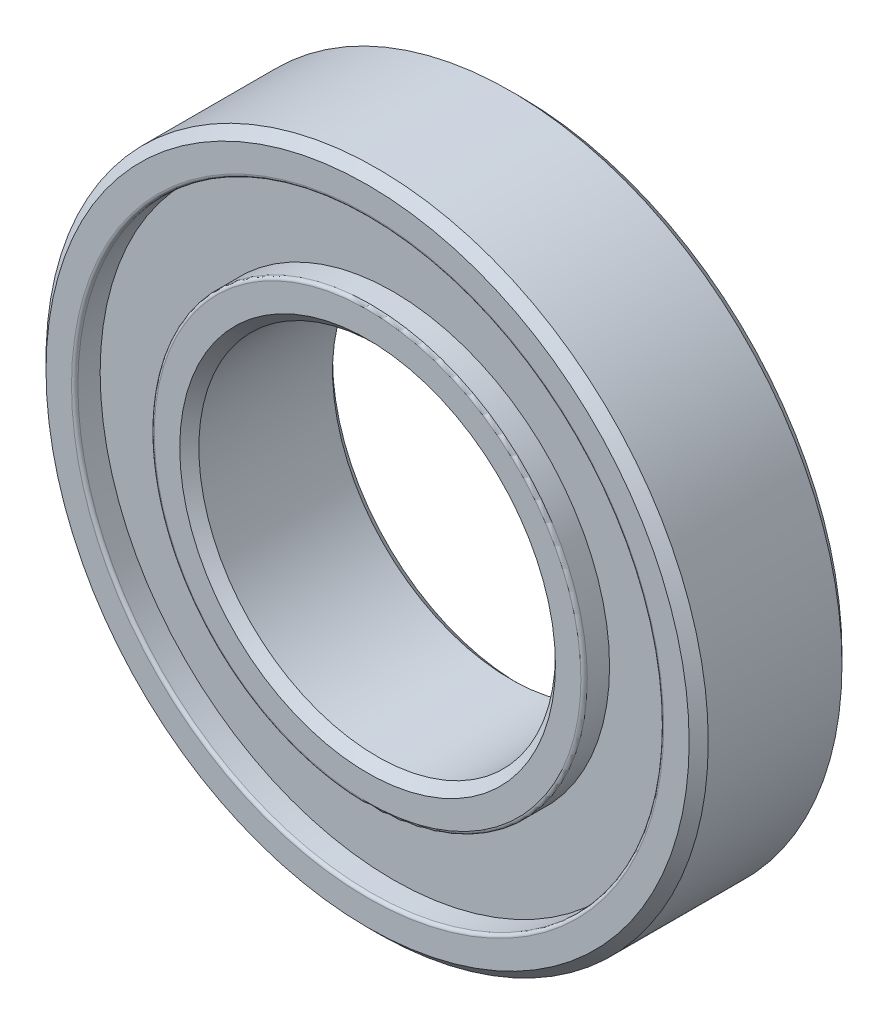
ISO-10303-21;
HEADER;
FILE_DESCRIPTION(('STEP AP214'),'2;1');
FILE_NAME('part.step','',(''),(''),'','','');
FILE_SCHEMA(('AUTOMOTIVE_DESIGN { 1 0 10303 214 1 1 1 1 }'));
ENDSEC;
DATA;
#1=APPLICATION_CONTEXT('core data for automotive mechanical design processes');
#2=APPLICATION_PROTOCOL_DEFINITION('international standard','automotive_design',2000,#1);
#3=PRODUCT_CONTEXT('',#1,'mechanical');
#4=PRODUCT('Part','Part','',(#3));
#5=PRODUCT_RELATED_PRODUCT_CATEGORY('part','',(#4));
#6=PRODUCT_DEFINITION_FORMATION('','',#4);
#7=PRODUCT_DEFINITION_CONTEXT('part definition',#1,'design');
#8=PRODUCT_DEFINITION('design','',#6,#7);
#9=PRODUCT_DEFINITION_SHAPE('','',#8);
#10=(LENGTH_UNIT() NAMED_UNIT(*) SI_UNIT(.MILLI.,.METRE.));
#11=(NAMED_UNIT(*) PLANE_ANGLE_UNIT() SI_UNIT($,.RADIAN.));
#12=(NAMED_UNIT(*) SI_UNIT($,.STERADIAN.) SOLID_ANGLE_UNIT());
#13=UNCERTAINTY_MEASURE_WITH_UNIT(LENGTH_MEASURE(1.E-05),#10,'distance_accuracy_value','');
#14=(GEOMETRIC_REPRESENTATION_CONTEXT(3) GLOBAL_UNCERTAINTY_ASSIGNED_CONTEXT((#13)) GLOBAL_UNIT_ASSIGNED_CONTEXT((#10,
#11,#12)) REPRESENTATION_CONTEXT('',''));
#15=CARTESIAN_POINT('',(0.,0.,0.));
#16=DIRECTION('',(0.,0.,1.));
#17=DIRECTION('',(1.,0.,0.));
#18=AXIS2_PLACEMENT_3D('',#15,#16,#17);
#19=CARTESIAN_POINT('',(0.,0.,-6.));
#20=DIRECTION('',(0.,0.,1.));
#21=DIRECTION('',(1.,0.,0.));
#22=AXIS2_PLACEMENT_3D('',#19,#20,#21);
#23=PLANE('',#22);
#24=CARTESIAN_POINT('',(0.,0.,-6.));
#25=DIRECTION('',(0.,0.,1.));
#26=DIRECTION('',(1.,0.,0.));
#27=AXIS2_PLACEMENT_3D('',#24,#25,#26);
#28=CIRCLE('',#27,16.75);
#29=CARTESIAN_POINT('',(16.75,0.,-6.));
#30=VERTEX_POINT('',#29);
#31=EDGE_CURVE('E10',#30,#30,#28,.F.);
#32=ORIENTED_EDGE('',*,*,#31,.T.);
#33=EDGE_LOOP('',(#32));
#34=FACE_BOUND('',#33,.T.);
#35=CARTESIAN_POINT('',(0.,0.,-6.));
#36=DIRECTION('',(0.,0.,1.));
#37=DIRECTION('',(1.,0.,0.));
#38=AXIS2_PLACEMENT_3D('',#35,#36,#37);
#39=CIRCLE('',#38,14.75);
#40=CARTESIAN_POINT('',(14.75,0.,-6.));
#41=VERTEX_POINT('',#40);
#42=EDGE_CURVE('E94',#41,#41,#39,.T.);
#43=ORIENTED_EDGE('',*,*,#42,.T.);
#44=EDGE_LOOP('',(#43));
#45=FACE_BOUND('',#44,.T.);
#46=ADVANCED_FACE('F41',(#34,#45),#23,.F.);
#47=CARTESIAN_POINT('',(0.,0.,6.));
#48=DIRECTION('',(0.,0.,1.));
#49=DIRECTION('',(1.,0.,0.));
#50=AXIS2_PLACEMENT_3D('',#47,#48,#49);
#51=PLANE('',#50);
#52=CARTESIAN_POINT('',(0.,0.,6.));
#53=DIRECTION('',(0.,0.,1.));
#54=DIRECTION('',(1.,0.,0.));
#55=AXIS2_PLACEMENT_3D('',#52,#53,#54);
#56=CIRCLE('',#55,16.75);
#57=CARTESIAN_POINT('',(16.75,0.,6.));
#58=VERTEX_POINT('',#57);
#59=EDGE_CURVE('E70',#58,#58,#56,.T.);
#60=ORIENTED_EDGE('',*,*,#59,.T.);
#61=EDGE_LOOP('',(#60));
#62=FACE_BOUND('',#61,.T.);
#63=CARTESIAN_POINT('',(0.,0.,6.));
#64=DIRECTION('',(0.,0.,1.));
#65=DIRECTION('',(1.,0.,0.));
#66=AXIS2_PLACEMENT_3D('',#63,#64,#65);
#67=CIRCLE('',#66,14.75);
#68=CARTESIAN_POINT('',(14.75,0.,6.));
#69=VERTEX_POINT('',#68);
#70=EDGE_CURVE('E76',#69,#69,#67,.F.);
#71=ORIENTED_EDGE('',*,*,#70,.T.);
#72=EDGE_LOOP('',(#71));
#73=FACE_BOUND('',#72,.T.);
#74=ADVANCED_FACE('F128',(#62,#73),#51,.T.);
#75=CARTESIAN_POINT('',(0.,0.,6.));
#76=DIRECTION('',(0.,0.,1.));
#77=DIRECTION('',(1.,0.,0.));
#78=AXIS2_PLACEMENT_3D('',#75,#76,#77);
#79=CIRCLE('',#78,23.25);
#80=CARTESIAN_POINT('',(23.25,0.,6.));
#81=VERTEX_POINT('',#80);
#82=EDGE_CURVE('E61',#81,#81,#79,.F.);
#83=ORIENTED_EDGE('',*,*,#82,.T.);
#84=EDGE_LOOP('',(#83));
#85=FACE_BOUND('',#84,.T.);
#86=CARTESIAN_POINT('',(0.,0.,6.));
#87=DIRECTION('',(0.,0.,1.));
#88=DIRECTION('',(1.,0.,0.));
#89=AXIS2_PLACEMENT_3D('',#86,#87,#88);
#90=CIRCLE('',#89,25.25);
#91=CARTESIAN_POINT('',(25.25,0.,6.));
#92=VERTEX_POINT('',#91);
#93=EDGE_CURVE('E73',#92,#92,#90,.T.);
#94=ORIENTED_EDGE('',*,*,#93,.T.);
#95=EDGE_LOOP('',(#94));
#96=FACE_BOUND('',#95,.T.);
#97=ADVANCED_FACE('F134',(#85,#96),#51,.T.);
#98=CARTESIAN_POINT('',(0.,0.,-6.));
#99=DIRECTION('',(0.,0.,1.));
#100=DIRECTION('',(1.,0.,0.));
#101=AXIS2_PLACEMENT_3D('',#98,#99,#100);
#102=CIRCLE('',#101,23.25);
#103=CARTESIAN_POINT('',(23.25,0.,-6.));
#104=VERTEX_POINT('',#103);
#105=EDGE_CURVE('E56',#104,#104,#102,.T.);
#106=ORIENTED_EDGE('',*,*,#105,.T.);
#107=EDGE_LOOP('',(#106));
#108=FACE_BOUND('',#107,.T.);
#109=CARTESIAN_POINT('',(0.,0.,-6.));
#110=DIRECTION('',(0.,0.,1.));
#111=DIRECTION('',(1.,0.,0.));
#112=AXIS2_PLACEMENT_3D('',#109,#110,#111);
#113=CIRCLE('',#112,25.25);
#114=CARTESIAN_POINT('',(25.25,0.,-6.));
#115=VERTEX_POINT('',#114);
#116=EDGE_CURVE('E79',#115,#115,#113,.F.);
#117=ORIENTED_EDGE('',*,*,#116,.T.);
#118=EDGE_LOOP('',(#117));
#119=FACE_BOUND('',#118,.T.);
#120=ADVANCED_FACE('F130',(#108,#119),#23,.F.);
#121=CARTESIAN_POINT('',(0.,0.,6.));
#122=DIRECTION('',(0.,0.,-1.));
#123=DIRECTION('',(-1.,0.,0.));
#124=AXIS2_PLACEMENT_3D('',#121,#122,#123);
#125=CYLINDRICAL_SURFACE('',#124,26.);
#126=CARTESIAN_POINT('',(0.,0.,-5.25));
#127=DIRECTION('',(0.,0.,1.));
#128=DIRECTION('',(1.,0.,0.));
#129=AXIS2_PLACEMENT_3D('',#126,#127,#128);
#130=CIRCLE('',#129,26.);
#131=CARTESIAN_POINT('',(26.,0.,-5.25));
#132=VERTEX_POINT('',#131);
#133=EDGE_CURVE('E82',#132,#132,#130,.T.);
#134=ORIENTED_EDGE('',*,*,#133,.T.);
#135=EDGE_LOOP('',(#134));
#136=FACE_BOUND('',#135,.T.);
#137=CARTESIAN_POINT('',(0.,0.,5.25));
#138=DIRECTION('',(0.,0.,1.));
#139=DIRECTION('',(1.,0.,0.));
#140=AXIS2_PLACEMENT_3D('',#137,#138,#139);
#141=CIRCLE('',#140,26.);
#142=CARTESIAN_POINT('',(26.,0.,5.25));
#143=VERTEX_POINT('',#142);
#144=EDGE_CURVE('E85',#143,#143,#141,.F.);
#145=ORIENTED_EDGE('',*,*,#144,.T.);
#146=EDGE_LOOP('',(#145));
#147=FACE_BOUND('',#146,.T.);
#148=ADVANCED_FACE('F140',(#136,#147),#125,.T.);
#149=CARTESIAN_POINT('',(0.,0.,6.));
#150=DIRECTION('',(0.,0.,-1.));
#151=DIRECTION('',(-1.,0.,0.));
#152=AXIS2_PLACEMENT_3D('',#149,#150,#151);
#153=CYLINDRICAL_SURFACE('',#152,14.);
#154=CARTESIAN_POINT('',(0.,0.,-5.25));
#155=DIRECTION('',(0.,0.,1.));
#156=DIRECTION('',(1.,0.,0.));
#157=AXIS2_PLACEMENT_3D('',#154,#155,#156);
#158=CIRCLE('',#157,14.);
#159=CARTESIAN_POINT('',(14.,0.,-5.25));
#160=VERTEX_POINT('',#159);
#161=EDGE_CURVE('E88',#160,#160,#158,.F.);
#162=ORIENTED_EDGE('',*,*,#161,.T.);
#163=EDGE_LOOP('',(#162));
#164=FACE_BOUND('',#163,.T.);
#165=CARTESIAN_POINT('',(0.,0.,5.24999999999999));
#166=DIRECTION('',(0.,0.,1.));
#167=DIRECTION('',(1.,0.,0.));
#168=AXIS2_PLACEMENT_3D('',#165,#166,#167);
#169=CIRCLE('',#168,14.);
#170=CARTESIAN_POINT('',(14.,0.,5.24999999999999));
#171=VERTEX_POINT('',#170);
#172=EDGE_CURVE('E91',#171,#171,#169,.T.);
#173=ORIENTED_EDGE('',*,*,#172,.T.);
#174=EDGE_LOOP('',(#173));
#175=FACE_BOUND('',#174,.T.);
#176=ADVANCED_FACE('F146',(#164,#175),#153,.F.);
#177=CARTESIAN_POINT('',(0.,0.,4.));
#178=DIRECTION('',(0.,0.,1.));
#179=DIRECTION('',(1.,0.,0.));
#180=AXIS2_PLACEMENT_3D('',#177,#178,#179);
#181=CYLINDRICAL_SURFACE('',#180,17.);
#182=CARTESIAN_POINT('',(0.,0.,5.75));
#183=DIRECTION('',(0.,0.,1.));
#184=DIRECTION('',(1.,0.,0.));
#185=AXIS2_PLACEMENT_3D('',#182,#183,#184);
#186=CIRCLE('',#185,17.);
#187=CARTESIAN_POINT('',(17.,0.,5.75));
#188=VERTEX_POINT('',#187);
#189=EDGE_CURVE('E67',#188,#188,#186,.F.);
#190=ORIENTED_EDGE('',*,*,#189,.T.);
#191=EDGE_LOOP('',(#190));
#192=FACE_BOUND('',#191,.T.);
#193=CARTESIAN_POINT('',(0.,0.,4.));
#194=DIRECTION('',(0.,0.,1.));
#195=DIRECTION('',(1.,0.,0.));
#196=AXIS2_PLACEMENT_3D('',#193,#194,#195);
#197=CIRCLE('',#196,17.);
#198=CARTESIAN_POINT('',(17.,0.,4.));
#199=VERTEX_POINT('',#198);
#200=EDGE_CURVE('E100',#199,#199,#197,.T.);
#201=ORIENTED_EDGE('',*,*,#200,.T.);
#202=EDGE_LOOP('',(#201));
#203=FACE_BOUND('',#202,.T.);
#204=ADVANCED_FACE('F220',(#192,#203),#181,.T.);
#205=CARTESIAN_POINT('',(0.,0.,4.));
#206=DIRECTION('',(0.,0.,1.));
#207=DIRECTION('',(1.,0.,0.));
#208=AXIS2_PLACEMENT_3D('',#205,#206,#207);
#209=CYLINDRICAL_SURFACE('',#208,23.);
#210=CARTESIAN_POINT('',(0.,0.,5.75));
#211=DIRECTION('',(0.,0.,1.));
#212=DIRECTION('',(1.,0.,0.));
#213=AXIS2_PLACEMENT_3D('',#210,#211,#212);
#214=CIRCLE('',#213,23.);
#215=CARTESIAN_POINT('',(23.,0.,5.75));
#216=VERTEX_POINT('',#215);
#217=EDGE_CURVE('E64',#216,#216,#214,.T.);
#218=ORIENTED_EDGE('',*,*,#217,.T.);
#219=EDGE_LOOP('',(#218));
#220=FACE_BOUND('',#219,.T.);
#221=CARTESIAN_POINT('',(0.,0.,4.));
#222=DIRECTION('',(0.,0.,1.));
#223=DIRECTION('',(1.,0.,0.));
#224=AXIS2_PLACEMENT_3D('',#221,#222,#223);
#225=CIRCLE('',#224,23.);
#226=CARTESIAN_POINT('',(23.,0.,4.));
#227=VERTEX_POINT('',#226);
#228=EDGE_CURVE('E97',#227,#227,#225,.T.);
#229=ORIENTED_EDGE('',*,*,#228,.F.);
#230=EDGE_LOOP('',(#229));
#231=FACE_BOUND('',#230,.T.);
#232=ADVANCED_FACE('F124',(#220,#231),#209,.F.);
#233=CARTESIAN_POINT('',(0.,0.,4.));
#234=DIRECTION('',(0.,0.,1.));
#235=DIRECTION('',(1.,0.,0.));
#236=AXIS2_PLACEMENT_3D('',#233,#234,#235);
#237=PLANE('',#236);
#238=ORIENTED_EDGE('',*,*,#200,.F.);
#239=EDGE_LOOP('',(#238));
#240=FACE_BOUND('',#239,.T.);
#241=ORIENTED_EDGE('',*,*,#228,.T.);
#242=EDGE_LOOP('',(#241));
#243=FACE_BOUND('',#242,.T.);
#244=ADVANCED_FACE('F116',(#240,#243),#237,.T.);
#245=CARTESIAN_POINT('',(0.,0.,-4.));
#246=DIRECTION('',(0.,0.,-1.));
#247=DIRECTION('',(-1.,0.,0.));
#248=AXIS2_PLACEMENT_3D('',#245,#246,#247);
#249=CYLINDRICAL_SURFACE('',#248,17.);
#250=CARTESIAN_POINT('',(0.,0.,-5.75));
#251=DIRECTION('',(0.,0.,1.));
#252=DIRECTION('',(1.,0.,0.));
#253=AXIS2_PLACEMENT_3D('',#250,#251,#252);
#254=CIRCLE('',#253,17.);
#255=CARTESIAN_POINT('',(17.,0.,-5.75));
#256=VERTEX_POINT('',#255);
#257=EDGE_CURVE('E48',#256,#256,#254,.T.);
#258=ORIENTED_EDGE('',*,*,#257,.T.);
#259=EDGE_LOOP('',(#258));
#260=FACE_BOUND('',#259,.T.);
#261=CARTESIAN_POINT('',(0.,0.,-4.));
#262=DIRECTION('',(0.,0.,1.));
#263=DIRECTION('',(1.,0.,0.));
#264=AXIS2_PLACEMENT_3D('',#261,#262,#263);
#265=CIRCLE('',#264,17.);
#266=CARTESIAN_POINT('',(17.,0.,-4.));
#267=VERTEX_POINT('',#266);
#268=EDGE_CURVE('E106',#267,#267,#265,.T.);
#269=ORIENTED_EDGE('',*,*,#268,.F.);
#270=EDGE_LOOP('',(#269));
#271=FACE_BOUND('',#270,.T.);
#272=ADVANCED_FACE('F113',(#260,#271),#249,.T.);
#273=CARTESIAN_POINT('',(0.,0.,-4.));
#274=DIRECTION('',(0.,0.,-1.));
#275=DIRECTION('',(-1.,0.,0.));
#276=AXIS2_PLACEMENT_3D('',#273,#274,#275);
#277=CYLINDRICAL_SURFACE('',#276,23.);
#278=CARTESIAN_POINT('',(0.,0.,-5.75));
#279=DIRECTION('',(0.,0.,1.));
#280=DIRECTION('',(1.,0.,0.));
#281=AXIS2_PLACEMENT_3D('',#278,#279,#280);
#282=CIRCLE('',#281,23.);
#283=CARTESIAN_POINT('',(23.,0.,-5.75));
#284=VERTEX_POINT('',#283);
#285=EDGE_CURVE('E52',#284,#284,#282,.F.);
#286=ORIENTED_EDGE('',*,*,#285,.T.);
#287=EDGE_LOOP('',(#286));
#288=FACE_BOUND('',#287,.T.);
#289=CARTESIAN_POINT('',(0.,0.,-4.));
#290=DIRECTION('',(0.,0.,1.));
#291=DIRECTION('',(1.,0.,0.));
#292=AXIS2_PLACEMENT_3D('',#289,#290,#291);
#293=CIRCLE('',#292,23.);
#294=CARTESIAN_POINT('',(23.,0.,-4.));
#295=VERTEX_POINT('',#294);
#296=EDGE_CURVE('E103',#295,#295,#293,.T.);
#297=ORIENTED_EDGE('',*,*,#296,.T.);
#298=EDGE_LOOP('',(#297));
#299=FACE_BOUND('',#298,.T.);
#300=ADVANCED_FACE('F115',(#288,#299),#277,.F.);
#301=CARTESIAN_POINT('',(0.,0.,-4.));
#302=DIRECTION('',(0.,0.,-1.));
#303=DIRECTION('',(1.,0.,0.));
#304=AXIS2_PLACEMENT_3D('',#301,#302,#303);
#305=PLANE('',#304);
#306=ORIENTED_EDGE('',*,*,#268,.T.);
#307=EDGE_LOOP('',(#306));
#308=FACE_BOUND('',#307,.T.);
#309=ORIENTED_EDGE('',*,*,#296,.F.);
#310=EDGE_LOOP('',(#309));
#311=FACE_BOUND('',#310,.T.);
#312=ADVANCED_FACE('F110',(#308,#311),#305,.T.);
#313=CARTESIAN_POINT('',(0.,0.,-6.));
#314=DIRECTION('',(0.,0.,-1.));
#315=DIRECTION('',(-1.,0.,0.));
#316=AXIS2_PLACEMENT_3D('',#313,#314,#315);
#317=CONICAL_SURFACE('',#316,14.75,0.785398163397446);
#318=ORIENTED_EDGE('',*,*,#161,.F.);
#319=EDGE_LOOP('',(#318));
#320=FACE_BOUND('',#319,.T.);
#321=ORIENTED_EDGE('',*,*,#42,.F.);
#322=EDGE_LOOP('',(#321));
#323=FACE_BOUND('',#322,.T.);
#324=ADVANCED_FACE('F157',(#320,#323),#317,.F.);
#325=CARTESIAN_POINT('',(0.,0.,-5.25));
#326=DIRECTION('',(0.,0.,1.));
#327=DIRECTION('',(1.,0.,0.));
#328=AXIS2_PLACEMENT_3D('',#325,#326,#327);
#329=CONICAL_SURFACE('',#328,26.,0.785398163397448);
#330=ORIENTED_EDGE('',*,*,#116,.F.);
#331=EDGE_LOOP('',(#330));
#332=FACE_BOUND('',#331,.T.);
#333=ORIENTED_EDGE('',*,*,#133,.F.);
#334=EDGE_LOOP('',(#333));
#335=FACE_BOUND('',#334,.T.);
#336=ADVANCED_FACE('F153',(#332,#335),#329,.T.);
#337=CARTESIAN_POINT('',(0.,0.,5.24999999999999));
#338=DIRECTION('',(0.,0.,1.));
#339=DIRECTION('',(1.,0.,0.));
#340=AXIS2_PLACEMENT_3D('',#337,#338,#339);
#341=CONICAL_SURFACE('',#340,14.,0.785398163397444);
#342=CARTESIAN_POINT('',(14.75,0.,6.));
#343=CARTESIAN_POINT('',(14.7421875,0.,5.9921875));
#344=CARTESIAN_POINT('',(14.734375,0.,5.984375));
#345=CARTESIAN_POINT('',(14.71875,0.,5.96875));
#346=CARTESIAN_POINT('',(14.7109375,0.,5.9609375));
#347=CARTESIAN_POINT('',(14.6953125,0.,5.9453125));
#348=CARTESIAN_POINT('',(14.6875,0.,5.9375));
#349=CARTESIAN_POINT('',(14.671875,0.,5.921875));
#350=CARTESIAN_POINT('',(14.6640625,0.,5.9140625));
#351=CARTESIAN_POINT('',(14.6484375,0.,5.8984375));
#352=CARTESIAN_POINT('',(14.640625,0.,5.890625));
#353=CARTESIAN_POINT('',(14.625,0.,5.875));
#354=CARTESIAN_POINT('',(14.6171875,0.,5.8671875));
#355=CARTESIAN_POINT('',(14.6015625,0.,5.8515625));
#356=CARTESIAN_POINT('',(14.59375,0.,5.84375));
#357=CARTESIAN_POINT('',(14.578125,0.,5.828125));
#358=CARTESIAN_POINT('',(14.5703125,0.,5.8203125));
#359=CARTESIAN_POINT('',(14.5546875,0.,5.8046875));
#360=CARTESIAN_POINT('',(14.546875,0.,5.796875));
#361=CARTESIAN_POINT('',(14.53125,0.,5.78125));
#362=CARTESIAN_POINT('',(14.5234375,0.,5.7734375));
#363=CARTESIAN_POINT('',(14.5078125,0.,5.7578125));
#364=CARTESIAN_POINT('',(14.5,0.,5.75));
#365=CARTESIAN_POINT('',(14.484375,0.,5.734375));
#366=CARTESIAN_POINT('',(14.4765625,0.,5.7265625));
#367=CARTESIAN_POINT('',(14.4609375,0.,5.7109375));
#368=CARTESIAN_POINT('',(14.453125,0.,5.703125));
#369=CARTESIAN_POINT('',(14.4375,0.,5.6875));
#370=CARTESIAN_POINT('',(14.4296875,0.,5.6796875));
#371=CARTESIAN_POINT('',(14.4140625,0.,5.6640625));
#372=CARTESIAN_POINT('',(14.40625,0.,5.65625));
#373=CARTESIAN_POINT('',(14.390625,0.,5.640625));
#374=CARTESIAN_POINT('',(14.3828125,0.,5.6328125));
#375=CARTESIAN_POINT('',(14.3671875,0.,5.6171875));
#376=CARTESIAN_POINT('',(14.359375,0.,5.609375));
#377=CARTESIAN_POINT('',(14.34375,0.,5.59375));
#378=CARTESIAN_POINT('',(14.3359375,0.,5.5859375));
#379=CARTESIAN_POINT('',(14.3203125,0.,5.5703125));
#380=CARTESIAN_POINT('',(14.3125,0.,5.5625));
#381=CARTESIAN_POINT('',(14.296875,0.,5.546875));
#382=CARTESIAN_POINT('',(14.2890625,0.,5.5390625));
#383=CARTESIAN_POINT('',(14.2734375,0.,5.5234375));
#384=CARTESIAN_POINT('',(14.265625,0.,5.515625));
#385=CARTESIAN_POINT('',(14.25,0.,5.5));
#386=CARTESIAN_POINT('',(14.2421875,0.,5.4921875));
#387=CARTESIAN_POINT('',(14.2265625,0.,5.4765625));
#388=CARTESIAN_POINT('',(14.21875,0.,5.46875));
#389=CARTESIAN_POINT('',(14.203125,0.,5.453125));
#390=CARTESIAN_POINT('',(14.1953125,0.,5.4453125));
#391=CARTESIAN_POINT('',(14.1796875,0.,5.4296875));
#392=CARTESIAN_POINT('',(14.171875,0.,5.421875));
#393=CARTESIAN_POINT('',(14.15625,0.,5.40625));
#394=CARTESIAN_POINT('',(14.1484375,0.,5.3984375));
#395=CARTESIAN_POINT('',(14.1328125,0.,5.3828125));
#396=CARTESIAN_POINT('',(14.125,0.,5.37499999999999));
#397=CARTESIAN_POINT('',(14.109375,0.,5.35937499999999));
#398=CARTESIAN_POINT('',(14.1015625,0.,5.35156249999999));
#399=CARTESIAN_POINT('',(14.0859375,0.,5.33593749999999));
#400=CARTESIAN_POINT('',(14.078125,0.,5.32812499999999));
#401=CARTESIAN_POINT('',(14.0625,0.,5.31249999999999));
#402=CARTESIAN_POINT('',(14.0546875,0.,5.30468749999999));
#403=CARTESIAN_POINT('',(14.0390625,0.,5.28906249999999));
#404=CARTESIAN_POINT('',(14.03125,0.,5.28124999999999));
#405=CARTESIAN_POINT('',(14.015625,0.,5.26562499999999));
#406=CARTESIAN_POINT('',(14.0078125,0.,5.2578125));
#407=CARTESIAN_POINT('',(14.,0.,5.24999999999999));
#408=B_SPLINE_CURVE_WITH_KNOTS('',3,(#342,#343,#344,#345,#346,#347,#348,#349,#350,#351,#352,
#353,#354,#355,#356,#357,#358,#359,#360,#361,#362,#363,#364,#365,#366,#367,#368,#369,#370,#371,
#372,#373,#374,#375,#376,#377,#378,#379,#380,#381,#382,#383,#384,#385,#386,#387,#388,#389,#390,
#391,#392,#393,#394,#395,#396,#397,#398,#399,#400,#401,#402,#403,#404,#405,#406,#407),
.UNSPECIFIED.,.F.,.F.,(4,2,2,2,2,2,2,2,2,2,2,2,2,2,2,2,2,2,2,2,2,2,2,2,2,2,2,2,2,2,2,2,4),(0.,
0.0331456303681201,0.0662912607362389,0.099436891104359,0.132582521472478,0.165728151840598,
0.198873782208717,0.232019412576836,0.265165042944956,0.298310673313076,0.331456303681195,
0.364601934049315,0.397747564417435,0.430893194785553,0.464038825153673,0.497184455521792,
0.530330085889913,0.563475716258032,0.596621346626152,0.629766976994271,0.662912607362391,
0.69605823773051,0.72920386809863,0.762349498466749,0.795495128834869,0.828640759202988,
0.861786389571107,0.894932019939228,0.928077650307347,0.961223280675467,0.994368911043585,
1.02751454141171,1.06066017177982),.UNSPECIFIED.);
#409=EDGE_CURVE('BSEAM156',#69,#171,#408,.T.);
#410=ORIENTED_EDGE('',*,*,#70,.F.);
#411=ORIENTED_EDGE('',*,*,#172,.F.);
#412=ORIENTED_EDGE('',*,*,#409,.T.);
#413=ORIENTED_EDGE('',*,*,#409,.F.);
#414=EDGE_LOOP('',(#410,#412,#411,#413));
#415=FACE_BOUND('',#414,.T.);
#416=ADVANCED_FACE('F156',(#415),#341,.F.);
#417=CARTESIAN_POINT('',(0.,0.,6.));
#418=DIRECTION('',(0.,0.,-1.));
#419=DIRECTION('',(-1.,0.,0.));
#420=AXIS2_PLACEMENT_3D('',#417,#418,#419);
#421=CONICAL_SURFACE('',#420,25.25,0.785398163397446);
#422=ORIENTED_EDGE('',*,*,#144,.F.);
#423=EDGE_LOOP('',(#422));
#424=FACE_BOUND('',#423,.T.);
#425=ORIENTED_EDGE('',*,*,#93,.F.);
#426=EDGE_LOOP('',(#425));
#427=FACE_BOUND('',#426,.T.);
#428=ADVANCED_FACE('F163',(#424,#427),#421,.T.);
#429=CARTESIAN_POINT('',(0.,0.,5.75));
#430=DIRECTION('',(0.,0.,1.));
#431=DIRECTION('',(1.,0.,0.));
#432=AXIS2_PLACEMENT_3D('',#429,#430,#431);
#433=TOROIDAL_SURFACE('',#432,16.75,0.25);
#434=ORIENTED_EDGE('',*,*,#189,.F.);
#435=EDGE_LOOP('',(#434));
#436=FACE_BOUND('',#435,.T.);
#437=ORIENTED_EDGE('',*,*,#59,.F.);
#438=EDGE_LOOP('',(#437));
#439=FACE_BOUND('',#438,.T.);
#440=ADVANCED_FACE('F166',(#436,#439),#433,.T.);
#441=CARTESIAN_POINT('',(0.,0.,5.75));
#442=DIRECTION('',(0.,0.,1.));
#443=DIRECTION('',(1.,0.,0.));
#444=AXIS2_PLACEMENT_3D('',#441,#442,#443);
#445=TOROIDAL_SURFACE('',#444,23.25,0.25);
#446=ORIENTED_EDGE('',*,*,#82,.F.);
#447=EDGE_LOOP('',(#446));
#448=FACE_BOUND('',#447,.T.);
#449=ORIENTED_EDGE('',*,*,#217,.F.);
#450=EDGE_LOOP('',(#449));
#451=FACE_BOUND('',#450,.T.);
#452=ADVANCED_FACE('F174',(#448,#451),#445,.T.);
#453=CARTESIAN_POINT('',(0.,0.,-5.75));
#454=DIRECTION('',(0.,0.,1.));
#455=DIRECTION('',(1.,0.,0.));
#456=AXIS2_PLACEMENT_3D('',#453,#454,#455);
#457=TOROIDAL_SURFACE('',#456,23.25,0.25);
#458=ORIENTED_EDGE('',*,*,#285,.F.);
#459=EDGE_LOOP('',(#458));
#460=FACE_BOUND('',#459,.T.);
#461=ORIENTED_EDGE('',*,*,#105,.F.);
#462=EDGE_LOOP('',(#461));
#463=FACE_BOUND('',#462,.T.);
#464=ADVANCED_FACE('F185',(#460,#463),#457,.T.);
#465=CARTESIAN_POINT('',(0.,0.,-5.75));
#466=DIRECTION('',(0.,0.,1.));
#467=DIRECTION('',(1.,0.,0.));
#468=AXIS2_PLACEMENT_3D('',#465,#466,#467);
#469=TOROIDAL_SURFACE('',#468,16.75,0.25);
#470=ORIENTED_EDGE('',*,*,#31,.F.);
#471=EDGE_LOOP('',(#470));
#472=FACE_BOUND('',#471,.T.);
#473=ORIENTED_EDGE('',*,*,#257,.F.);
#474=EDGE_LOOP('',(#473));
#475=FACE_BOUND('',#474,.T.);
#476=ADVANCED_FACE('F43',(#472,#475),#469,.T.);
#477=CLOSED_SHELL('',(#46,#74,#97,#120,#148,#176,#204,#232,#244,#272,#300,#312,#324,#336,#416,
#428,#440,#452,#464,#476));
#478=MANIFOLD_SOLID_BREP('B2',#477);
#479=ADVANCED_BREP_SHAPE_REPRESENTATION('',(#18,#478),#14);
#480=SHAPE_DEFINITION_REPRESENTATION(#9,#479);
ENDSEC;
END-ISO-10303-21;
